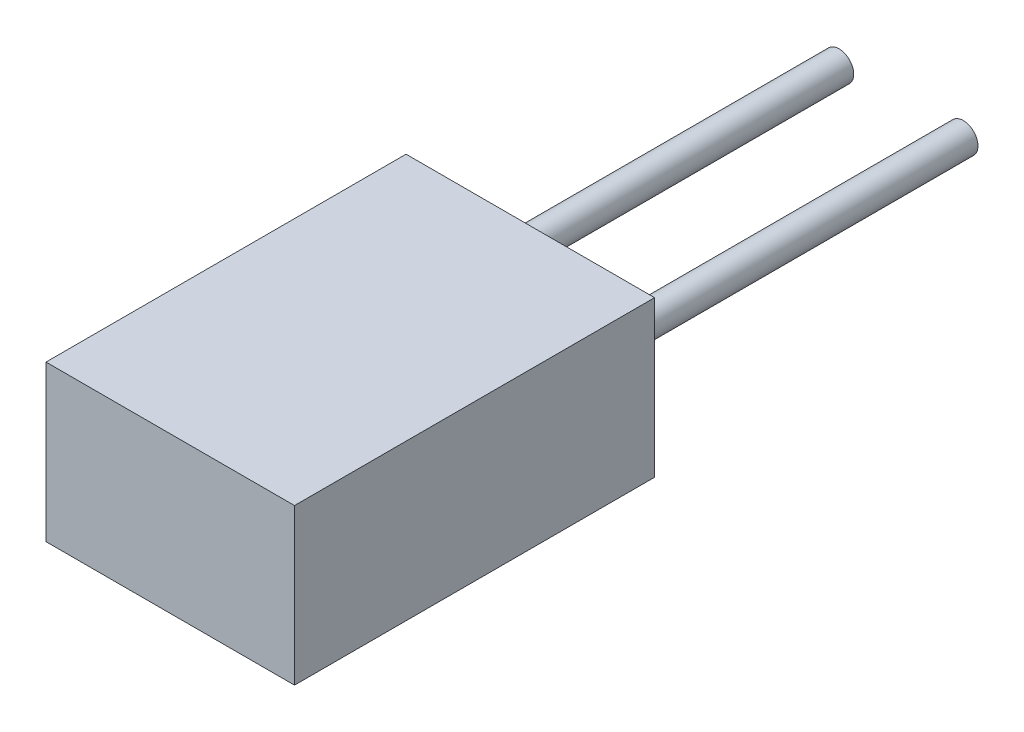
ISO-10303-21;
HEADER;
FILE_DESCRIPTION(('STEP AP214'),'2;1');
FILE_NAME('part.step','',(''),(''),'','','');
FILE_SCHEMA(('AUTOMOTIVE_DESIGN { 1 0 10303 214 1 1 1 1 }'));
ENDSEC;
DATA;
#1=APPLICATION_CONTEXT('core data for automotive mechanical design processes');
#2=APPLICATION_PROTOCOL_DEFINITION('international standard','automotive_design',2000,#1);
#3=PRODUCT_CONTEXT('',#1,'mechanical');
#4=PRODUCT('Part','Part','',(#3));
#5=PRODUCT_RELATED_PRODUCT_CATEGORY('part','',(#4));
#6=PRODUCT_DEFINITION_FORMATION('','',#4);
#7=PRODUCT_DEFINITION_CONTEXT('part definition',#1,'design');
#8=PRODUCT_DEFINITION('design','',#6,#7);
#9=PRODUCT_DEFINITION_SHAPE('','',#8);
#10=(LENGTH_UNIT() NAMED_UNIT(*) SI_UNIT(.MILLI.,.METRE.));
#11=(NAMED_UNIT(*) PLANE_ANGLE_UNIT() SI_UNIT($,.RADIAN.));
#12=(NAMED_UNIT(*) SI_UNIT($,.STERADIAN.) SOLID_ANGLE_UNIT());
#13=UNCERTAINTY_MEASURE_WITH_UNIT(LENGTH_MEASURE(1.E-05),#10,'distance_accuracy_value','');
#14=(GEOMETRIC_REPRESENTATION_CONTEXT(3) GLOBAL_UNCERTAINTY_ASSIGNED_CONTEXT((#13)) GLOBAL_UNIT_ASSIGNED_CONTEXT((#10,
#11,#12)) REPRESENTATION_CONTEXT('',''));
#15=CARTESIAN_POINT('',(0.,0.,0.));
#16=DIRECTION('',(0.,0.,1.));
#17=DIRECTION('',(1.,0.,0.));
#18=AXIS2_PLACEMENT_3D('',#15,#16,#17);
#19=CARTESIAN_POINT('',(1.27008128,0.000121920000000122,-0.581279));
#20=DIRECTION('',(0.,0.,1.));
#21=DIRECTION('',(1.,0.,0.));
#22=AXIS2_PLACEMENT_3D('',#19,#20,#21);
#23=CYLINDRICAL_SURFACE('',#22,0.2999994);
#24=CARTESIAN_POINT('',(1.27008128,0.000121920000000122,-0.581279));
#25=DIRECTION('',(0.,0.,-1.));
#26=DIRECTION('',(1.,0.,0.));
#27=AXIS2_PLACEMENT_3D('',#24,#25,#26);
#28=CIRCLE('',#27,0.2999994);
#29=CARTESIAN_POINT('',(1.57008068,0.000121920000000122,-0.581279));
#30=VERTEX_POINT('',#29);
#31=EDGE_CURVE('P0_E11',#30,#30,#28,.T.);
#32=ORIENTED_EDGE('',*,*,#31,.T.);
#33=DIRECTION('',(0.,0.,-1.));
#34=VECTOR('',#33,1.);
#35=CARTESIAN_POINT('',(1.57008068,0.000121920000000122,-0.581279));
#36=LINE('',#35,#34);
#37=CARTESIAN_POINT('',(1.57008068,0.000121919999999265,-7.58128024));
#38=VERTEX_POINT('',#37);
#39=EDGE_CURVE('P0_E23',#30,#38,#36,.T.);
#40=ORIENTED_EDGE('',*,*,#39,.T.);
#41=CARTESIAN_POINT('',(1.27008128,0.000121919999999265,-7.58128024));
#42=DIRECTION('',(0.,0.,-1.));
#43=DIRECTION('',(1.,0.,0.));
#44=AXIS2_PLACEMENT_3D('',#41,#42,#43);
#45=CIRCLE('',#44,0.2999994);
#46=EDGE_CURVE('P0_E31',#38,#38,#45,.T.);
#47=ORIENTED_EDGE('',*,*,#46,.F.);
#48=ORIENTED_EDGE('',*,*,#39,.F.);
#49=EDGE_LOOP('',(#32,#40,#47,#48));
#50=FACE_BOUND('',#49,.T.);
#51=ADVANCED_FACE('P0_F16',(#50),#23,.T.);
#52=CARTESIAN_POINT('',(1.27008128,0.000121920000000135,-0.581279));
#53=DIRECTION('',(0.,0.,-1.));
#54=DIRECTION('',(1.,0.,0.));
#55=AXIS2_PLACEMENT_3D('',#52,#53,#54);
#56=PLANE('',#55);
#57=ORIENTED_EDGE('',*,*,#31,.F.);
#58=EDGE_LOOP('',(#57));
#59=FACE_BOUND('',#58,.T.);
#60=ADVANCED_FACE('P0_F36',(#59),#56,.F.);
#61=CARTESIAN_POINT('',(1.27008128,0.000121919999999277,-7.58128024));
#62=DIRECTION('',(0.,0.,-1.));
#63=DIRECTION('',(1.,0.,0.));
#64=AXIS2_PLACEMENT_3D('',#61,#62,#63);
#65=PLANE('',#64);
#66=ORIENTED_EDGE('',*,*,#46,.T.);
#67=EDGE_LOOP('',(#66));
#68=FACE_BOUND('',#67,.T.);
#69=ADVANCED_FACE('P0_F33',(#68),#65,.T.);
#70=CLOSED_SHELL('',(#51,#60,#69));
#71=MANIFOLD_SOLID_BREP('P0_B1',#70);
#72=CARTESIAN_POINT('',(-1.26991872,4.06400000001225E-05,-0.581279));
#73=DIRECTION('',(0.,0.,1.));
#74=DIRECTION('',(1.,0.,0.));
#75=AXIS2_PLACEMENT_3D('',#72,#73,#74);
#76=CYLINDRICAL_SURFACE('',#75,0.2999994);
#77=CARTESIAN_POINT('',(-1.26991872,4.06400000001225E-05,-0.581279));
#78=DIRECTION('',(0.,0.,-1.));
#79=DIRECTION('',(1.,0.,0.));
#80=AXIS2_PLACEMENT_3D('',#77,#78,#79);
#81=CIRCLE('',#80,0.2999994);
#82=CARTESIAN_POINT('',(-0.96991932,4.06400000001225E-05,-0.581279));
#83=VERTEX_POINT('',#82);
#84=EDGE_CURVE('P1_E11',#83,#83,#81,.T.);
#85=ORIENTED_EDGE('',*,*,#84,.T.);
#86=DIRECTION('',(0.,0.,-1.));
#87=VECTOR('',#86,1.);
#88=CARTESIAN_POINT('',(-0.96991932,4.06400000001225E-05,-0.581279));
#89=LINE('',#88,#87);
#90=CARTESIAN_POINT('',(-0.96991932,4.06399999992652E-05,-7.58128024));
#91=VERTEX_POINT('',#90);
#92=EDGE_CURVE('P1_E23',#83,#91,#89,.T.);
#93=ORIENTED_EDGE('',*,*,#92,.T.);
#94=CARTESIAN_POINT('',(-1.26991872,4.06399999992652E-05,-7.58128024));
#95=DIRECTION('',(0.,0.,-1.));
#96=DIRECTION('',(1.,0.,0.));
#97=AXIS2_PLACEMENT_3D('',#94,#95,#96);
#98=CIRCLE('',#97,0.2999994);
#99=EDGE_CURVE('P1_E31',#91,#91,#98,.T.);
#100=ORIENTED_EDGE('',*,*,#99,.F.);
#101=ORIENTED_EDGE('',*,*,#92,.F.);
#102=EDGE_LOOP('',(#85,#93,#100,#101));
#103=FACE_BOUND('',#102,.T.);
#104=ADVANCED_FACE('P1_F16',(#103),#76,.T.);
#105=CARTESIAN_POINT('',(-1.26991872,4.06400000001347E-05,-0.581279));
#106=DIRECTION('',(0.,0.,-1.));
#107=DIRECTION('',(1.,0.,0.));
#108=AXIS2_PLACEMENT_3D('',#105,#106,#107);
#109=PLANE('',#108);
#110=ORIENTED_EDGE('',*,*,#84,.F.);
#111=EDGE_LOOP('',(#110));
#112=FACE_BOUND('',#111,.T.);
#113=ADVANCED_FACE('P1_F36',(#112),#109,.F.);
#114=CARTESIAN_POINT('',(-1.26991872,4.06399999992775E-05,-7.58128024));
#115=DIRECTION('',(0.,0.,-1.));
#116=DIRECTION('',(1.,0.,0.));
#117=AXIS2_PLACEMENT_3D('',#114,#115,#116);
#118=PLANE('',#117);
#119=ORIENTED_EDGE('',*,*,#99,.T.);
#120=EDGE_LOOP('',(#119));
#121=FACE_BOUND('',#120,.T.);
#122=ADVANCED_FACE('P1_F33',(#121),#118,.T.);
#123=CLOSED_SHELL('',(#104,#113,#122));
#124=MANIFOLD_SOLID_BREP('P1_B1',#123);
#125=CARTESIAN_POINT('',(-2.54,1.58999936,0.));
#126=DIRECTION('',(0.,1.,0.));
#127=DIRECTION('',(1.,0.,0.));
#128=AXIS2_PLACEMENT_3D('',#125,#126,#127);
#129=PLANE('',#128);
#130=DIRECTION('',(0.,0.,1.));
#131=VECTOR('',#130,1.);
#132=CARTESIAN_POINT('',(-2.54,1.58999936,0.));
#133=LINE('',#132,#131);
#134=CARTESIAN_POINT('',(-2.54,1.58999936,0.));
#135=VERTEX_POINT('',#134);
#136=CARTESIAN_POINT('',(-2.54,1.58999936,7.36000052));
#137=VERTEX_POINT('',#136);
#138=EDGE_CURVE('P2_E11',#135,#137,#133,.T.);
#139=ORIENTED_EDGE('',*,*,#138,.T.);
#140=DIRECTION('',(1.,0.,0.));
#141=VECTOR('',#140,1.);
#142=CARTESIAN_POINT('',(-2.54,1.58999936,7.36000052));
#143=LINE('',#142,#141);
#144=CARTESIAN_POINT('',(2.54,1.58999936,7.36000052));
#145=VERTEX_POINT('',#144);
#146=EDGE_CURVE('P2_E23',#137,#145,#143,.T.);
#147=ORIENTED_EDGE('',*,*,#146,.T.);
#148=DIRECTION('',(0.,0.,1.));
#149=VECTOR('',#148,1.);
#150=CARTESIAN_POINT('',(2.54,1.58999936,0.));
#151=LINE('',#150,#149);
#152=CARTESIAN_POINT('',(2.54,1.58999936,0.));
#153=VERTEX_POINT('',#152);
#154=EDGE_CURVE('P2_E84',#153,#145,#151,.T.);
#155=ORIENTED_EDGE('',*,*,#154,.F.);
#156=DIRECTION('',(1.,0.,0.));
#157=VECTOR('',#156,1.);
#158=CARTESIAN_POINT('',(-2.54,1.58999936,0.));
#159=LINE('',#158,#157);
#160=EDGE_CURVE('P2_E82',#135,#153,#159,.T.);
#161=ORIENTED_EDGE('',*,*,#160,.F.);
#162=EDGE_LOOP('',(#139,#147,#155,#161));
#163=FACE_BOUND('',#162,.T.);
#164=ADVANCED_FACE('P2_F16',(#163),#129,.T.);
#165=CARTESIAN_POINT('',(2.54,1.58999936,0.));
#166=DIRECTION('',(1.,0.,0.));
#167=DIRECTION('',(0.,-1.,0.));
#168=AXIS2_PLACEMENT_3D('',#165,#166,#167);
#169=PLANE('',#168);
#170=ORIENTED_EDGE('',*,*,#154,.T.);
#171=DIRECTION('',(0.,-1.,0.));
#172=VECTOR('',#171,1.);
#173=CARTESIAN_POINT('',(2.54,1.58999936,7.36000052));
#174=LINE('',#173,#172);
#175=CARTESIAN_POINT('',(2.54,-1.58999936,7.36000052));
#176=VERTEX_POINT('',#175);
#177=EDGE_CURVE('P2_E80',#145,#176,#174,.T.);
#178=ORIENTED_EDGE('',*,*,#177,.T.);
#179=DIRECTION('',(0.,0.,1.));
#180=VECTOR('',#179,1.);
#181=CARTESIAN_POINT('',(2.54,-1.58999936,0.));
#182=LINE('',#181,#180);
#183=CARTESIAN_POINT('',(2.54,-1.58999936,0.));
#184=VERTEX_POINT('',#183);
#185=EDGE_CURVE('P2_E78',#184,#176,#182,.T.);
#186=ORIENTED_EDGE('',*,*,#185,.F.);
#187=DIRECTION('',(0.,-1.,0.));
#188=VECTOR('',#187,1.);
#189=CARTESIAN_POINT('',(2.54,1.58999936,0.));
#190=LINE('',#189,#188);
#191=EDGE_CURVE('P2_E69',#153,#184,#190,.T.);
#192=ORIENTED_EDGE('',*,*,#191,.F.);
#193=EDGE_LOOP('',(#170,#178,#186,#192));
#194=FACE_BOUND('',#193,.T.);
#195=ADVANCED_FACE('P2_F89',(#194),#169,.T.);
#196=CARTESIAN_POINT('',(2.54,-1.58999936,0.));
#197=DIRECTION('',(0.,-1.,0.));
#198=DIRECTION('',(-1.,0.,0.));
#199=AXIS2_PLACEMENT_3D('',#196,#197,#198);
#200=PLANE('',#199);
#201=ORIENTED_EDGE('',*,*,#185,.T.);
#202=DIRECTION('',(-1.,0.,0.));
#203=VECTOR('',#202,1.);
#204=CARTESIAN_POINT('',(2.54,-1.58999936,7.36000052));
#205=LINE('',#204,#203);
#206=CARTESIAN_POINT('',(-2.54,-1.58999936,7.36000052));
#207=VERTEX_POINT('',#206);
#208=EDGE_CURVE('P2_E59',#176,#207,#205,.T.);
#209=ORIENTED_EDGE('',*,*,#208,.T.);
#210=DIRECTION('',(0.,0.,1.));
#211=VECTOR('',#210,1.);
#212=CARTESIAN_POINT('',(-2.54,-1.58999936,0.));
#213=LINE('',#212,#211);
#214=CARTESIAN_POINT('',(-2.54,-1.58999936,0.));
#215=VERTEX_POINT('',#214);
#216=EDGE_CURVE('P2_E53',#215,#207,#213,.T.);
#217=ORIENTED_EDGE('',*,*,#216,.F.);
#218=DIRECTION('',(-1.,0.,0.));
#219=VECTOR('',#218,1.);
#220=CARTESIAN_POINT('',(2.54,-1.58999936,0.));
#221=LINE('',#220,#219);
#222=EDGE_CURVE('P2_E57',#184,#215,#221,.T.);
#223=ORIENTED_EDGE('',*,*,#222,.F.);
#224=EDGE_LOOP('',(#201,#209,#217,#223));
#225=FACE_BOUND('',#224,.T.);
#226=ADVANCED_FACE('P2_F56',(#225),#200,.T.);
#227=CARTESIAN_POINT('',(-2.54,-1.58999936,0.));
#228=DIRECTION('',(-1.,0.,0.));
#229=DIRECTION('',(0.,1.,0.));
#230=AXIS2_PLACEMENT_3D('',#227,#228,#229);
#231=PLANE('',#230);
#232=ORIENTED_EDGE('',*,*,#216,.T.);
#233=DIRECTION('',(0.,1.,0.));
#234=VECTOR('',#233,1.);
#235=CARTESIAN_POINT('',(-2.54,-1.58999936,7.36000052));
#236=LINE('',#235,#234);
#237=EDGE_CURVE('P2_E70',#207,#137,#236,.T.);
#238=ORIENTED_EDGE('',*,*,#237,.T.);
#239=ORIENTED_EDGE('',*,*,#138,.F.);
#240=DIRECTION('',(0.,1.,0.));
#241=VECTOR('',#240,1.);
#242=CARTESIAN_POINT('',(-2.54,-1.58999936,0.));
#243=LINE('',#242,#241);
#244=EDGE_CURVE('P2_E67',#215,#135,#243,.T.);
#245=ORIENTED_EDGE('',*,*,#244,.F.);
#246=EDGE_LOOP('',(#232,#238,#239,#245));
#247=FACE_BOUND('',#246,.T.);
#248=ADVANCED_FACE('P2_F72',(#247),#231,.T.);
#249=CARTESIAN_POINT('',(0.,0.,0.));
#250=DIRECTION('',(0.,0.,-1.));
#251=DIRECTION('',(1.,0.,0.));
#252=AXIS2_PLACEMENT_3D('',#249,#250,#251);
#253=PLANE('',#252);
#254=ORIENTED_EDGE('',*,*,#160,.T.);
#255=ORIENTED_EDGE('',*,*,#191,.T.);
#256=ORIENTED_EDGE('',*,*,#222,.T.);
#257=ORIENTED_EDGE('',*,*,#244,.T.);
#258=EDGE_LOOP('',(#254,#255,#256,#257));
#259=FACE_BOUND('',#258,.T.);
#260=ADVANCED_FACE('P2_F66',(#259),#253,.T.);
#261=CARTESIAN_POINT('',(0.,0.,7.36000052));
#262=DIRECTION('',(0.,0.,-1.));
#263=DIRECTION('',(1.,0.,0.));
#264=AXIS2_PLACEMENT_3D('',#261,#262,#263);
#265=PLANE('',#264);
#266=ORIENTED_EDGE('',*,*,#237,.F.);
#267=ORIENTED_EDGE('',*,*,#208,.F.);
#268=ORIENTED_EDGE('',*,*,#177,.F.);
#269=ORIENTED_EDGE('',*,*,#146,.F.);
#270=EDGE_LOOP('',(#266,#267,#268,#269));
#271=FACE_BOUND('',#270,.T.);
#272=ADVANCED_FACE('P2_F90',(#271),#265,.F.);
#273=CLOSED_SHELL('',(#164,#195,#226,#248,#260,#272));
#274=MANIFOLD_SOLID_BREP('P2_B1',#273);
#275=ADVANCED_BREP_SHAPE_REPRESENTATION('',(#18,#71,#124,#274),#14);
#276=SHAPE_DEFINITION_REPRESENTATION(#9,#275);
ENDSEC;
END-ISO-10303-21;
